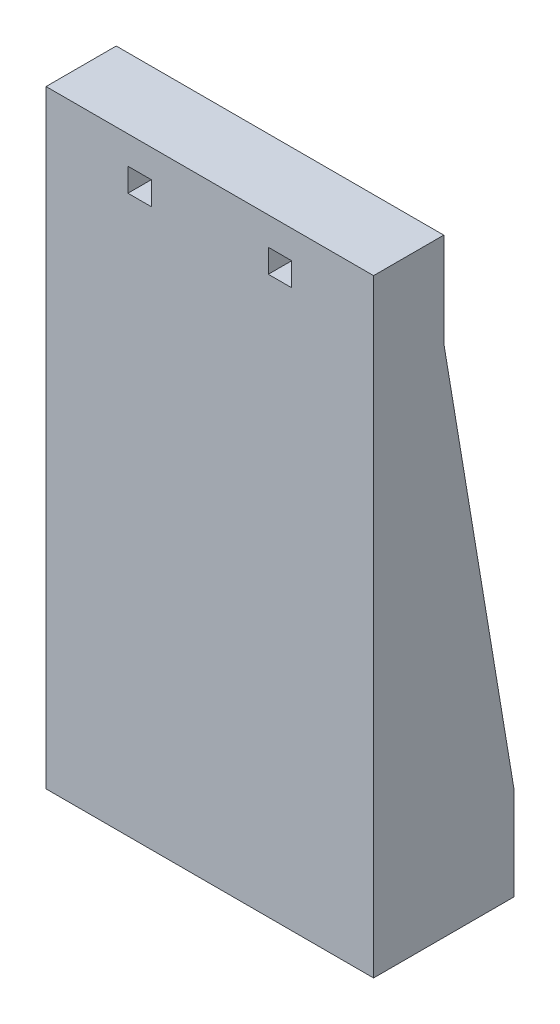
ISO-10303-21;
HEADER;
FILE_DESCRIPTION(('STEP AP214'),'2;1');
FILE_NAME('part.step','',(''),(''),'','','');
FILE_SCHEMA(('AUTOMOTIVE_DESIGN { 1 0 10303 214 1 1 1 1 }'));
ENDSEC;
DATA;
#1=APPLICATION_CONTEXT('core data for automotive mechanical design processes');
#2=APPLICATION_PROTOCOL_DEFINITION('international standard','automotive_design',2000,#1);
#3=PRODUCT_CONTEXT('',#1,'mechanical');
#4=PRODUCT('Part','Part','',(#3));
#5=PRODUCT_RELATED_PRODUCT_CATEGORY('part','',(#4));
#6=PRODUCT_DEFINITION_FORMATION('','',#4);
#7=PRODUCT_DEFINITION_CONTEXT('part definition',#1,'design');
#8=PRODUCT_DEFINITION('design','',#6,#7);
#9=PRODUCT_DEFINITION_SHAPE('','',#8);
#10=(LENGTH_UNIT() NAMED_UNIT(*) SI_UNIT(.MILLI.,.METRE.));
#11=(NAMED_UNIT(*) PLANE_ANGLE_UNIT() SI_UNIT($,.RADIAN.));
#12=(NAMED_UNIT(*) SI_UNIT($,.STERADIAN.) SOLID_ANGLE_UNIT());
#13=UNCERTAINTY_MEASURE_WITH_UNIT(LENGTH_MEASURE(1.E-05),#10,'distance_accuracy_value','');
#14=(GEOMETRIC_REPRESENTATION_CONTEXT(3) GLOBAL_UNCERTAINTY_ASSIGNED_CONTEXT((#13)) GLOBAL_UNIT_ASSIGNED_CONTEXT((#10,
#11,#12)) REPRESENTATION_CONTEXT('',''));
#15=CARTESIAN_POINT('',(0.,0.,0.));
#16=DIRECTION('',(0.,0.,1.));
#17=DIRECTION('',(1.,0.,0.));
#18=AXIS2_PLACEMENT_3D('',#15,#16,#17);
#19=CARTESIAN_POINT('',(35.,0.,15.));
#20=DIRECTION('',(0.,0.,1.));
#21=DIRECTION('',(0.,-1.,0.));
#22=AXIS2_PLACEMENT_3D('',#19,#20,#21);
#23=PLANE('',#22);
#24=DIRECTION('',(-1.,0.,0.));
#25=VECTOR('',#24,1.);
#26=CARTESIAN_POINT('',(17.5,114.,15.));
#27=LINE('',#26,#25);
#28=CARTESIAN_POINT('',(17.5,114.,15.));
#29=VERTEX_POINT('',#28);
#30=CARTESIAN_POINT('',(12.5,114.,15.));
#31=VERTEX_POINT('',#30);
#32=EDGE_CURVE('E56',#29,#31,#27,.T.);
#33=ORIENTED_EDGE('',*,*,#32,.F.);
#34=DIRECTION('',(0.,-1.,0.));
#35=VECTOR('',#34,1.);
#36=CARTESIAN_POINT('',(17.5,114.,15.));
#37=LINE('',#36,#35);
#38=CARTESIAN_POINT('',(17.5,109.,15.));
#39=VERTEX_POINT('',#38);
#40=EDGE_CURVE('E189',#29,#39,#37,.T.);
#41=ORIENTED_EDGE('',*,*,#40,.T.);
#42=DIRECTION('',(-1.,0.,0.));
#43=VECTOR('',#42,1.);
#44=CARTESIAN_POINT('',(17.5,109.,15.));
#45=LINE('',#44,#43);
#46=CARTESIAN_POINT('',(12.5,109.,15.));
#47=VERTEX_POINT('',#46);
#48=EDGE_CURVE('E193',#39,#47,#45,.T.);
#49=ORIENTED_EDGE('',*,*,#48,.T.);
#50=DIRECTION('',(0.,-1.,0.));
#51=VECTOR('',#50,1.);
#52=CARTESIAN_POINT('',(12.5,114.,15.));
#53=LINE('',#52,#51);
#54=EDGE_CURVE('E202',#31,#47,#53,.T.);
#55=ORIENTED_EDGE('',*,*,#54,.F.);
#56=EDGE_LOOP('',(#33,#41,#49,#55));
#57=FACE_BOUND('',#56,.T.);
#58=DIRECTION('',(0.,1.,0.));
#59=VECTOR('',#58,1.);
#60=CARTESIAN_POINT('',(-35.,0.,15.));
#61=LINE('',#60,#59);
#62=CARTESIAN_POINT('',(-35.,-10.,15.));
#63=VERTEX_POINT('',#62);
#64=CARTESIAN_POINT('',(-35.,120.,15.));
#65=VERTEX_POINT('',#64);
#66=EDGE_CURVE('E307',#63,#65,#61,.T.);
#67=ORIENTED_EDGE('',*,*,#66,.F.);
#68=DIRECTION('',(-1.,0.,0.));
#69=VECTOR('',#68,1.);
#70=CARTESIAN_POINT('',(35.,-10.,15.));
#71=LINE('',#70,#69);
#72=CARTESIAN_POINT('',(35.,-10.,15.));
#73=VERTEX_POINT('',#72);
#74=EDGE_CURVE('E49',#73,#63,#71,.T.);
#75=ORIENTED_EDGE('',*,*,#74,.F.);
#76=DIRECTION('',(0.,1.,0.));
#77=VECTOR('',#76,1.);
#78=CARTESIAN_POINT('',(35.,0.,15.));
#79=LINE('',#78,#77);
#80=CARTESIAN_POINT('',(35.,120.,15.));
#81=VERTEX_POINT('',#80);
#82=EDGE_CURVE('E316',#73,#81,#79,.T.);
#83=ORIENTED_EDGE('',*,*,#82,.T.);
#84=DIRECTION('',(-1.,0.,0.));
#85=VECTOR('',#84,1.);
#86=CARTESIAN_POINT('',(35.,120.,15.));
#87=LINE('',#86,#85);
#88=EDGE_CURVE('E331',#81,#65,#87,.T.);
#89=ORIENTED_EDGE('',*,*,#88,.T.);
#90=EDGE_LOOP('',(#67,#75,#83,#89));
#91=FACE_BOUND('',#90,.T.);
#92=DIRECTION('',(-1.,0.,0.));
#93=VECTOR('',#92,1.);
#94=CARTESIAN_POINT('',(-12.5,114.,15.));
#95=LINE('',#94,#93);
#96=CARTESIAN_POINT('',(-12.5,114.,15.));
#97=VERTEX_POINT('',#96);
#98=CARTESIAN_POINT('',(-17.5,114.,15.));
#99=VERTEX_POINT('',#98);
#100=EDGE_CURVE('E230',#97,#99,#95,.T.);
#101=ORIENTED_EDGE('',*,*,#100,.F.);
#102=DIRECTION('',(0.,-1.,0.));
#103=VECTOR('',#102,1.);
#104=CARTESIAN_POINT('',(-12.5,114.,15.));
#105=LINE('',#104,#103);
#106=CARTESIAN_POINT('',(-12.5,109.,15.));
#107=VERTEX_POINT('',#106);
#108=EDGE_CURVE('E64',#97,#107,#105,.T.);
#109=ORIENTED_EDGE('',*,*,#108,.T.);
#110=DIRECTION('',(-1.,0.,0.));
#111=VECTOR('',#110,1.);
#112=CARTESIAN_POINT('',(-12.5,109.,15.));
#113=LINE('',#112,#111);
#114=CARTESIAN_POINT('',(-17.5,109.,15.));
#115=VERTEX_POINT('',#114);
#116=EDGE_CURVE('E239',#107,#115,#113,.T.);
#117=ORIENTED_EDGE('',*,*,#116,.T.);
#118=DIRECTION('',(0.,-1.,0.));
#119=VECTOR('',#118,1.);
#120=CARTESIAN_POINT('',(-17.5,114.,15.));
#121=LINE('',#120,#119);
#122=EDGE_CURVE('E234',#99,#115,#121,.T.);
#123=ORIENTED_EDGE('',*,*,#122,.F.);
#124=EDGE_LOOP('',(#101,#109,#117,#123));
#125=FACE_BOUND('',#124,.T.);
#126=ADVANCED_FACE('F41',(#57,#91,#125),#23,.T.);
#127=CARTESIAN_POINT('',(35.,10.,0.));
#128=DIRECTION('',(0.,1.,0.));
#129=DIRECTION('',(0.,0.,1.));
#130=AXIS2_PLACEMENT_3D('',#127,#128,#129);
#131=PLANE('',#130);
#132=DIRECTION('',(-1.,0.,0.));
#133=VECTOR('',#132,1.);
#134=CARTESIAN_POINT('',(35.,10.,-15.));
#135=LINE('',#134,#133);
#136=CARTESIAN_POINT('',(31.,10.,-15.));
#137=VERTEX_POINT('',#136);
#138=CARTESIAN_POINT('',(-31.,10.,-15.));
#139=VERTEX_POINT('',#138);
#140=EDGE_CURVE('E351',#137,#139,#135,.T.);
#141=ORIENTED_EDGE('',*,*,#140,.T.);
#142=DIRECTION('',(0.,0.,1.));
#143=VECTOR('',#142,1.);
#144=CARTESIAN_POINT('',(-31.,10.,0.));
#145=LINE('',#144,#143);
#146=CARTESIAN_POINT('',(-31.,10.,10.));
#147=VERTEX_POINT('',#146);
#148=EDGE_CURVE('E262',#139,#147,#145,.T.);
#149=ORIENTED_EDGE('',*,*,#148,.T.);
#150=DIRECTION('',(-1.,0.,0.));
#151=VECTOR('',#150,1.);
#152=CARTESIAN_POINT('',(35.,10.,10.));
#153=LINE('',#152,#151);
#154=CARTESIAN_POINT('',(31.,10.,10.));
#155=VERTEX_POINT('',#154);
#156=EDGE_CURVE('E347',#155,#147,#153,.T.);
#157=ORIENTED_EDGE('',*,*,#156,.F.);
#158=DIRECTION('',(0.,0.,-1.));
#159=VECTOR('',#158,1.);
#160=CARTESIAN_POINT('',(31.,10.,0.));
#161=LINE('',#160,#159);
#162=EDGE_CURVE('E290',#155,#137,#161,.T.);
#163=ORIENTED_EDGE('',*,*,#162,.T.);
#164=EDGE_LOOP('',(#141,#149,#157,#163));
#165=FACE_BOUND('',#164,.T.);
#166=ADVANCED_FACE('F388',(#165),#131,.T.);
#167=CARTESIAN_POINT('',(35.,0.,10.));
#168=DIRECTION('',(0.,0.,1.));
#169=DIRECTION('',(0.,-1.,0.));
#170=AXIS2_PLACEMENT_3D('',#167,#168,#169);
#171=PLANE('',#170);
#172=DIRECTION('',(0.,-1.,0.));
#173=VECTOR('',#172,1.);
#174=CARTESIAN_POINT('',(-31.,0.,10.));
#175=LINE('',#174,#173);
#176=CARTESIAN_POINT('',(-31.,100.,10.));
#177=VERTEX_POINT('',#176);
#178=EDGE_CURVE('E268',#177,#147,#175,.T.);
#179=ORIENTED_EDGE('',*,*,#178,.F.);
#180=DIRECTION('',(1.,0.,0.));
#181=VECTOR('',#180,1.);
#182=CARTESIAN_POINT('',(-35.,100.,10.));
#183=LINE('',#182,#181);
#184=CARTESIAN_POINT('',(31.,100.,10.));
#185=VERTEX_POINT('',#184);
#186=EDGE_CURVE('E299',#177,#185,#183,.T.);
#187=ORIENTED_EDGE('',*,*,#186,.T.);
#188=DIRECTION('',(0.,1.,0.));
#189=VECTOR('',#188,1.);
#190=CARTESIAN_POINT('',(31.,0.,10.));
#191=LINE('',#190,#189);
#192=EDGE_CURVE('E283',#155,#185,#191,.T.);
#193=ORIENTED_EDGE('',*,*,#192,.F.);
#194=ORIENTED_EDGE('',*,*,#156,.T.);
#195=EDGE_LOOP('',(#179,#187,#193,#194));
#196=FACE_BOUND('',#195,.T.);
#197=ADVANCED_FACE('F396',(#196),#171,.F.);
#198=CARTESIAN_POINT('',(-35.,100.,10.));
#199=DIRECTION('',(0.,-1.,0.));
#200=DIRECTION('',(0.,0.,-1.));
#201=AXIS2_PLACEMENT_3D('',#198,#199,#200);
#202=PLANE('',#201);
#203=ORIENTED_EDGE('',*,*,#186,.F.);
#204=DIRECTION('',(0.,0.,-1.));
#205=VECTOR('',#204,1.);
#206=CARTESIAN_POINT('',(-31.,100.,10.));
#207=LINE('',#206,#205);
#208=CARTESIAN_POINT('',(-31.,100.,0.));
#209=VERTEX_POINT('',#208);
#210=EDGE_CURVE('E272',#177,#209,#207,.T.);
#211=ORIENTED_EDGE('',*,*,#210,.T.);
#212=DIRECTION('',(1.,0.,0.));
#213=VECTOR('',#212,1.);
#214=CARTESIAN_POINT('',(-35.,100.,0.));
#215=LINE('',#214,#213);
#216=CARTESIAN_POINT('',(31.,100.,0.));
#217=VERTEX_POINT('',#216);
#218=EDGE_CURVE('E312',#209,#217,#215,.T.);
#219=ORIENTED_EDGE('',*,*,#218,.T.);
#220=DIRECTION('',(0.,0.,1.));
#221=VECTOR('',#220,1.);
#222=CARTESIAN_POINT('',(31.,100.,10.));
#223=LINE('',#222,#221);
#224=EDGE_CURVE('E11',#217,#185,#223,.T.);
#225=ORIENTED_EDGE('',*,*,#224,.T.);
#226=EDGE_LOOP('',(#203,#211,#219,#225));
#227=FACE_BOUND('',#226,.T.);
#228=ADVANCED_FACE('F399',(#227),#202,.T.);
#229=CARTESIAN_POINT('',(35.,-10.,0.));
#230=DIRECTION('',(0.,1.,0.));
#231=DIRECTION('',(0.,0.,1.));
#232=AXIS2_PLACEMENT_3D('',#229,#230,#231);
#233=PLANE('',#232);
#234=DIRECTION('',(0.,0.,-1.));
#235=VECTOR('',#234,1.);
#236=CARTESIAN_POINT('',(-35.,-10.,0.));
#237=LINE('',#236,#235);
#238=CARTESIAN_POINT('',(-35.,-10.,-15.));
#239=VERTEX_POINT('',#238);
#240=EDGE_CURVE('E335',#63,#239,#237,.T.);
#241=ORIENTED_EDGE('',*,*,#240,.T.);
#242=DIRECTION('',(-1.,0.,0.));
#243=VECTOR('',#242,1.);
#244=CARTESIAN_POINT('',(35.,-10.,-15.));
#245=LINE('',#244,#243);
#246=CARTESIAN_POINT('',(35.,-10.,-15.));
#247=VERTEX_POINT('',#246);
#248=EDGE_CURVE('E355',#247,#239,#245,.T.);
#249=ORIENTED_EDGE('',*,*,#248,.F.);
#250=DIRECTION('',(0.,0.,-1.));
#251=VECTOR('',#250,1.);
#252=CARTESIAN_POINT('',(35.,-10.,0.));
#253=LINE('',#252,#251);
#254=EDGE_CURVE('E320',#73,#247,#253,.T.);
#255=ORIENTED_EDGE('',*,*,#254,.F.);
#256=ORIENTED_EDGE('',*,*,#74,.T.);
#257=EDGE_LOOP('',(#241,#249,#255,#256));
#258=FACE_BOUND('',#257,.T.);
#259=ADVANCED_FACE('F361',(#258),#233,.F.);
#260=CARTESIAN_POINT('',(35.,0.,-15.));
#261=DIRECTION('',(0.,0.,-1.));
#262=DIRECTION('',(0.,1.,0.));
#263=AXIS2_PLACEMENT_3D('',#260,#261,#262);
#264=PLANE('',#263);
#265=DIRECTION('',(1.,0.,0.));
#266=VECTOR('',#265,1.);
#267=CARTESIAN_POINT('',(35.,9.99999999999999,-15.));
#268=LINE('',#267,#266);
#269=CARTESIAN_POINT('',(-35.,10.,-15.));
#270=VERTEX_POINT('',#269);
#271=EDGE_CURVE('E276',#270,#139,#268,.T.);
#272=ORIENTED_EDGE('',*,*,#271,.T.);
#273=ORIENTED_EDGE('',*,*,#140,.F.);
#274=CARTESIAN_POINT('',(35.,9.99999999999994,-15.));
#275=VERTEX_POINT('',#274);
#276=EDGE_CURVE('E352',#275,#137,#135,.T.);
#277=ORIENTED_EDGE('',*,*,#276,.F.);
#278=DIRECTION('',(0.,-1.,0.));
#279=VECTOR('',#278,1.);
#280=CARTESIAN_POINT('',(35.,0.,-15.));
#281=LINE('',#280,#279);
#282=EDGE_CURVE('E324',#275,#247,#281,.T.);
#283=ORIENTED_EDGE('',*,*,#282,.T.);
#284=ORIENTED_EDGE('',*,*,#248,.T.);
#285=DIRECTION('',(0.,-1.,0.));
#286=VECTOR('',#285,1.);
#287=CARTESIAN_POINT('',(-35.,0.,-15.));
#288=LINE('',#287,#286);
#289=EDGE_CURVE('E339',#270,#239,#288,.T.);
#290=ORIENTED_EDGE('',*,*,#289,.F.);
#291=EDGE_LOOP('',(#272,#273,#277,#283,#284,#290));
#292=FACE_BOUND('',#291,.T.);
#293=ADVANCED_FACE('F384',(#292),#264,.T.);
#294=CARTESIAN_POINT('',(35.,120.,3.33066907387547E-13));
#295=DIRECTION('',(0.,1.,0.));
#296=DIRECTION('',(0.,0.,1.));
#297=AXIS2_PLACEMENT_3D('',#294,#295,#296);
#298=PLANE('',#297);
#299=DIRECTION('',(1.,0.,0.));
#300=VECTOR('',#299,1.);
#301=CARTESIAN_POINT('',(-35.,120.,0.));
#302=LINE('',#301,#300);
#303=CARTESIAN_POINT('',(-35.,120.,0.));
#304=VERTEX_POINT('',#303);
#305=CARTESIAN_POINT('',(35.,120.,0.));
#306=VERTEX_POINT('',#305);
#307=EDGE_CURVE('E303',#304,#306,#302,.T.);
#308=ORIENTED_EDGE('',*,*,#307,.F.);
#309=DIRECTION('',(0.,0.,-1.));
#310=VECTOR('',#309,1.);
#311=CARTESIAN_POINT('',(-35.,120.,3.33066907387547E-13));
#312=LINE('',#311,#310);
#313=EDGE_CURVE('E321',#65,#304,#312,.T.);
#314=ORIENTED_EDGE('',*,*,#313,.F.);
#315=ORIENTED_EDGE('',*,*,#88,.F.);
#316=DIRECTION('',(0.,0.,-1.));
#317=VECTOR('',#316,1.);
#318=CARTESIAN_POINT('',(35.,120.,3.33066907387547E-13));
#319=LINE('',#318,#317);
#320=EDGE_CURVE('E328',#81,#306,#319,.T.);
#321=ORIENTED_EDGE('',*,*,#320,.T.);
#322=EDGE_LOOP('',(#308,#314,#315,#321));
#323=FACE_BOUND('',#322,.T.);
#324=ADVANCED_FACE('F374',(#323),#298,.T.);
#325=CARTESIAN_POINT('',(35.,0.,0.));
#326=DIRECTION('',(1.,0.,0.));
#327=DIRECTION('',(0.,0.,-1.));
#328=AXIS2_PLACEMENT_3D('',#325,#326,#327);
#329=PLANE('',#328);
#330=ORIENTED_EDGE('',*,*,#282,.F.);
#331=DIRECTION('',(0.,-0.986393923832144,-0.164398987305357));
#332=VECTOR('',#331,1.);
#333=CARTESIAN_POINT('',(35.,100.,0.));
#334=LINE('',#333,#332);
#335=CARTESIAN_POINT('',(35.,100.,0.));
#336=VERTEX_POINT('',#335);
#337=EDGE_CURVE('E280',#336,#275,#334,.T.);
#338=ORIENTED_EDGE('',*,*,#337,.F.);
#339=DIRECTION('',(0.,1.,0.));
#340=VECTOR('',#339,1.);
#341=CARTESIAN_POINT('',(35.,120.,0.));
#342=LINE('',#341,#340);
#343=EDGE_CURVE('E294',#336,#306,#342,.T.);
#344=ORIENTED_EDGE('',*,*,#343,.T.);
#345=ORIENTED_EDGE('',*,*,#320,.F.);
#346=ORIENTED_EDGE('',*,*,#82,.F.);
#347=ORIENTED_EDGE('',*,*,#254,.T.);
#348=EDGE_LOOP('',(#330,#338,#344,#345,#346,#347));
#349=FACE_BOUND('',#348,.T.);
#350=ADVANCED_FACE('F414',(#349),#329,.T.);
#351=CARTESIAN_POINT('',(-35.,0.,0.));
#352=DIRECTION('',(1.,0.,0.));
#353=DIRECTION('',(0.,0.,-1.));
#354=AXIS2_PLACEMENT_3D('',#351,#352,#353);
#355=PLANE('',#354);
#356=DIRECTION('',(0.,1.,0.));
#357=VECTOR('',#356,1.);
#358=CARTESIAN_POINT('',(-35.,120.,0.));
#359=LINE('',#358,#357);
#360=CARTESIAN_POINT('',(-35.,100.,0.));
#361=VERTEX_POINT('',#360);
#362=EDGE_CURVE('E295',#361,#304,#359,.T.);
#363=ORIENTED_EDGE('',*,*,#362,.F.);
#364=DIRECTION('',(0.,-0.986393923832144,-0.164398987305357));
#365=VECTOR('',#364,1.);
#366=CARTESIAN_POINT('',(-35.,100.,0.));
#367=LINE('',#366,#365);
#368=EDGE_CURVE('E258',#361,#270,#367,.T.);
#369=ORIENTED_EDGE('',*,*,#368,.T.);
#370=ORIENTED_EDGE('',*,*,#289,.T.);
#371=ORIENTED_EDGE('',*,*,#240,.F.);
#372=ORIENTED_EDGE('',*,*,#66,.T.);
#373=ORIENTED_EDGE('',*,*,#313,.T.);
#374=EDGE_LOOP('',(#363,#369,#370,#371,#372,#373));
#375=FACE_BOUND('',#374,.T.);
#376=ADVANCED_FACE('F368',(#375),#355,.F.);
#377=CARTESIAN_POINT('',(-35.,120.,0.));
#378=DIRECTION('',(0.,0.,-1.));
#379=DIRECTION('',(0.,1.,0.));
#380=AXIS2_PLACEMENT_3D('',#377,#378,#379);
#381=PLANE('',#380);
#382=ORIENTED_EDGE('',*,*,#343,.F.);
#383=EDGE_CURVE('E313',#217,#336,#215,.T.);
#384=ORIENTED_EDGE('',*,*,#383,.F.);
#385=ORIENTED_EDGE('',*,*,#218,.F.);
#386=EDGE_CURVE('E308',#361,#209,#215,.T.);
#387=ORIENTED_EDGE('',*,*,#386,.F.);
#388=ORIENTED_EDGE('',*,*,#362,.T.);
#389=ORIENTED_EDGE('',*,*,#307,.T.);
#390=EDGE_LOOP('',(#382,#384,#385,#387,#388,#389));
#391=FACE_BOUND('',#390,.T.);
#392=ADVANCED_FACE('F409',(#391),#381,.T.);
#393=CARTESIAN_POINT('',(35.,100.,0.));
#394=DIRECTION('',(0.,-0.164398987305357,0.986393923832144));
#395=DIRECTION('',(0.,-0.986393923832144,-0.164398987305357));
#396=AXIS2_PLACEMENT_3D('',#393,#394,#395);
#397=PLANE('',#396);
#398=ORIENTED_EDGE('',*,*,#337,.T.);
#399=ORIENTED_EDGE('',*,*,#276,.T.);
#400=DIRECTION('',(0.,-0.986393923832144,-0.164398987305357));
#401=VECTOR('',#400,1.);
#402=CARTESIAN_POINT('',(31.,100.,0.));
#403=LINE('',#402,#401);
#404=EDGE_CURVE('E279',#217,#137,#403,.T.);
#405=ORIENTED_EDGE('',*,*,#404,.F.);
#406=ORIENTED_EDGE('',*,*,#383,.T.);
#407=EDGE_LOOP('',(#398,#399,#405,#406));
#408=FACE_BOUND('',#407,.T.);
#409=ADVANCED_FACE('F406',(#408),#397,.F.);
#410=CARTESIAN_POINT('',(31.,55.,0.));
#411=DIRECTION('',(1.,0.,0.));
#412=DIRECTION('',(0.,0.,-1.));
#413=AXIS2_PLACEMENT_3D('',#410,#411,#412);
#414=PLANE('',#413);
#415=ORIENTED_EDGE('',*,*,#162,.F.);
#416=ORIENTED_EDGE('',*,*,#192,.T.);
#417=ORIENTED_EDGE('',*,*,#224,.F.);
#418=ORIENTED_EDGE('',*,*,#404,.T.);
#419=EDGE_LOOP('',(#415,#416,#417,#418));
#420=FACE_BOUND('',#419,.T.);
#421=ADVANCED_FACE('F403',(#420),#414,.F.);
#422=CARTESIAN_POINT('',(-35.,100.,0.));
#423=DIRECTION('',(0.,0.164398987305357,-0.986393923832144));
#424=DIRECTION('',(0.,-0.986393923832144,-0.164398987305357));
#425=AXIS2_PLACEMENT_3D('',#422,#423,#424);
#426=PLANE('',#425);
#427=ORIENTED_EDGE('',*,*,#271,.F.);
#428=ORIENTED_EDGE('',*,*,#368,.F.);
#429=ORIENTED_EDGE('',*,*,#386,.T.);
#430=DIRECTION('',(0.,-0.986393923832144,-0.164398987305357));
#431=VECTOR('',#430,1.);
#432=CARTESIAN_POINT('',(-31.,100.,0.));
#433=LINE('',#432,#431);
#434=EDGE_CURVE('E211',#209,#139,#433,.T.);
#435=ORIENTED_EDGE('',*,*,#434,.T.);
#436=EDGE_LOOP('',(#427,#428,#429,#435));
#437=FACE_BOUND('',#436,.T.);
#438=ADVANCED_FACE('F379',(#437),#426,.T.);
#439=CARTESIAN_POINT('',(-31.,55.,0.));
#440=DIRECTION('',(-1.,0.,0.));
#441=DIRECTION('',(0.,0.,1.));
#442=AXIS2_PLACEMENT_3D('',#439,#440,#441);
#443=PLANE('',#442);
#444=ORIENTED_EDGE('',*,*,#210,.F.);
#445=ORIENTED_EDGE('',*,*,#178,.T.);
#446=ORIENTED_EDGE('',*,*,#148,.F.);
#447=ORIENTED_EDGE('',*,*,#434,.F.);
#448=EDGE_LOOP('',(#444,#445,#446,#447));
#449=FACE_BOUND('',#448,.T.);
#450=ADVANCED_FACE('F393',(#449),#443,.F.);
#451=CARTESIAN_POINT('',(-12.5,114.,5.));
#452=DIRECTION('',(-1.,0.,0.));
#453=DIRECTION('',(0.,-1.,0.));
#454=AXIS2_PLACEMENT_3D('',#451,#452,#453);
#455=PLANE('',#454);
#456=ORIENTED_EDGE('',*,*,#108,.F.);
#457=DIRECTION('',(0.,0.,1.));
#458=VECTOR('',#457,1.);
#459=CARTESIAN_POINT('',(-12.5,114.,5.));
#460=LINE('',#459,#458);
#461=CARTESIAN_POINT('',(-12.5,114.,5.));
#462=VERTEX_POINT('',#461);
#463=EDGE_CURVE('E226',#462,#97,#460,.T.);
#464=ORIENTED_EDGE('',*,*,#463,.F.);
#465=DIRECTION('',(0.,-1.,0.));
#466=VECTOR('',#465,1.);
#467=CARTESIAN_POINT('',(-12.5,114.,5.));
#468=LINE('',#467,#466);
#469=CARTESIAN_POINT('',(-12.5,109.,5.));
#470=VERTEX_POINT('',#469);
#471=EDGE_CURVE('E235',#462,#470,#468,.T.);
#472=ORIENTED_EDGE('',*,*,#471,.T.);
#473=DIRECTION('',(0.,0.,1.));
#474=VECTOR('',#473,1.);
#475=CARTESIAN_POINT('',(-12.5,109.,5.));
#476=LINE('',#475,#474);
#477=EDGE_CURVE('E217',#470,#107,#476,.T.);
#478=ORIENTED_EDGE('',*,*,#477,.T.);
#479=EDGE_LOOP('',(#456,#464,#472,#478));
#480=FACE_BOUND('',#479,.T.);
#481=ADVANCED_FACE('F450',(#480),#455,.T.);
#482=CARTESIAN_POINT('',(-12.5,109.,5.));
#483=DIRECTION('',(0.,1.,0.));
#484=DIRECTION('',(0.,0.,1.));
#485=AXIS2_PLACEMENT_3D('',#482,#483,#484);
#486=PLANE('',#485);
#487=ORIENTED_EDGE('',*,*,#116,.F.);
#488=ORIENTED_EDGE('',*,*,#477,.F.);
#489=DIRECTION('',(-1.,0.,0.));
#490=VECTOR('',#489,1.);
#491=CARTESIAN_POINT('',(-12.5,109.,5.));
#492=LINE('',#491,#490);
#493=CARTESIAN_POINT('',(-17.5,109.,5.));
#494=VERTEX_POINT('',#493);
#495=EDGE_CURVE('E252',#470,#494,#492,.T.);
#496=ORIENTED_EDGE('',*,*,#495,.T.);
#497=DIRECTION('',(0.,0.,1.));
#498=VECTOR('',#497,1.);
#499=CARTESIAN_POINT('',(-17.5,109.,5.));
#500=LINE('',#499,#498);
#501=EDGE_CURVE('E220',#494,#115,#500,.T.);
#502=ORIENTED_EDGE('',*,*,#501,.T.);
#503=EDGE_LOOP('',(#487,#488,#496,#502));
#504=FACE_BOUND('',#503,.T.);
#505=ADVANCED_FACE('F453',(#504),#486,.T.);
#506=CARTESIAN_POINT('',(-17.5,114.,5.));
#507=DIRECTION('',(-1.,0.,0.));
#508=DIRECTION('',(0.,-1.,0.));
#509=AXIS2_PLACEMENT_3D('',#506,#507,#508);
#510=PLANE('',#509);
#511=ORIENTED_EDGE('',*,*,#122,.T.);
#512=ORIENTED_EDGE('',*,*,#501,.F.);
#513=DIRECTION('',(0.,-1.,0.));
#514=VECTOR('',#513,1.);
#515=CARTESIAN_POINT('',(-17.5,114.,5.));
#516=LINE('',#515,#514);
#517=CARTESIAN_POINT('',(-17.5,114.,5.));
#518=VERTEX_POINT('',#517);
#519=EDGE_CURVE('E248',#518,#494,#516,.T.);
#520=ORIENTED_EDGE('',*,*,#519,.F.);
#521=DIRECTION('',(0.,0.,1.));
#522=VECTOR('',#521,1.);
#523=CARTESIAN_POINT('',(-17.5,114.,5.));
#524=LINE('',#523,#522);
#525=EDGE_CURVE('E223',#518,#99,#524,.T.);
#526=ORIENTED_EDGE('',*,*,#525,.T.);
#527=EDGE_LOOP('',(#511,#512,#520,#526));
#528=FACE_BOUND('',#527,.T.);
#529=ADVANCED_FACE('F456',(#528),#510,.F.);
#530=CARTESIAN_POINT('',(-12.5,114.,5.));
#531=DIRECTION('',(0.,1.,0.));
#532=DIRECTION('',(0.,0.,1.));
#533=AXIS2_PLACEMENT_3D('',#530,#531,#532);
#534=PLANE('',#533);
#535=ORIENTED_EDGE('',*,*,#100,.T.);
#536=ORIENTED_EDGE('',*,*,#525,.F.);
#537=DIRECTION('',(-1.,0.,0.));
#538=VECTOR('',#537,1.);
#539=CARTESIAN_POINT('',(-12.5,114.,5.));
#540=LINE('',#539,#538);
#541=EDGE_CURVE('E229',#462,#518,#540,.T.);
#542=ORIENTED_EDGE('',*,*,#541,.F.);
#543=ORIENTED_EDGE('',*,*,#463,.T.);
#544=EDGE_LOOP('',(#535,#536,#542,#543));
#545=FACE_BOUND('',#544,.T.);
#546=ADVANCED_FACE('F460',(#545),#534,.F.);
#547=CARTESIAN_POINT('',(0.,0.,5.));
#548=DIRECTION('',(0.,0.,-1.));
#549=DIRECTION('',(-1.,0.,0.));
#550=AXIS2_PLACEMENT_3D('',#547,#548,#549);
#551=PLANE('',#550);
#552=ORIENTED_EDGE('',*,*,#471,.F.);
#553=ORIENTED_EDGE('',*,*,#541,.T.);
#554=ORIENTED_EDGE('',*,*,#519,.T.);
#555=ORIENTED_EDGE('',*,*,#495,.F.);
#556=EDGE_LOOP('',(#552,#553,#554,#555));
#557=FACE_BOUND('',#556,.T.);
#558=ADVANCED_FACE('F444',(#557),#551,.F.);
#559=CARTESIAN_POINT('',(17.5,114.,5.));
#560=DIRECTION('',(0.,1.,0.));
#561=DIRECTION('',(0.,0.,1.));
#562=AXIS2_PLACEMENT_3D('',#559,#560,#561);
#563=PLANE('',#562);
#564=ORIENTED_EDGE('',*,*,#32,.T.);
#565=DIRECTION('',(0.,0.,1.));
#566=VECTOR('',#565,1.);
#567=CARTESIAN_POINT('',(12.5,114.,5.));
#568=LINE('',#567,#566);
#569=CARTESIAN_POINT('',(12.5,114.,5.));
#570=VERTEX_POINT('',#569);
#571=EDGE_CURVE('E165',#570,#31,#568,.T.);
#572=ORIENTED_EDGE('',*,*,#571,.F.);
#573=DIRECTION('',(-1.,0.,0.));
#574=VECTOR('',#573,1.);
#575=CARTESIAN_POINT('',(17.5,114.,5.));
#576=LINE('',#575,#574);
#577=CARTESIAN_POINT('',(17.5,114.,5.));
#578=VERTEX_POINT('',#577);
#579=EDGE_CURVE('E169',#578,#570,#576,.T.);
#580=ORIENTED_EDGE('',*,*,#579,.F.);
#581=DIRECTION('',(0.,0.,1.));
#582=VECTOR('',#581,1.);
#583=CARTESIAN_POINT('',(17.5,114.,5.));
#584=LINE('',#583,#582);
#585=EDGE_CURVE('E208',#578,#29,#584,.T.);
#586=ORIENTED_EDGE('',*,*,#585,.T.);
#587=EDGE_LOOP('',(#564,#572,#580,#586));
#588=FACE_BOUND('',#587,.T.);
#589=ADVANCED_FACE('F167',(#588),#563,.F.);
#590=CARTESIAN_POINT('',(17.5,114.,5.));
#591=DIRECTION('',(-1.,0.,0.));
#592=DIRECTION('',(0.,-1.,0.));
#593=AXIS2_PLACEMENT_3D('',#590,#591,#592);
#594=PLANE('',#593);
#595=ORIENTED_EDGE('',*,*,#40,.F.);
#596=ORIENTED_EDGE('',*,*,#585,.F.);
#597=DIRECTION('',(0.,-1.,0.));
#598=VECTOR('',#597,1.);
#599=CARTESIAN_POINT('',(17.5,114.,5.));
#600=LINE('',#599,#598);
#601=CARTESIAN_POINT('',(17.5,109.,5.));
#602=VERTEX_POINT('',#601);
#603=EDGE_CURVE('E175',#578,#602,#600,.T.);
#604=ORIENTED_EDGE('',*,*,#603,.T.);
#605=DIRECTION('',(0.,0.,1.));
#606=VECTOR('',#605,1.);
#607=CARTESIAN_POINT('',(17.5,109.,5.));
#608=LINE('',#607,#606);
#609=EDGE_CURVE('E212',#602,#39,#608,.T.);
#610=ORIENTED_EDGE('',*,*,#609,.T.);
#611=EDGE_LOOP('',(#595,#596,#604,#610));
#612=FACE_BOUND('',#611,.T.);
#613=ADVANCED_FACE('F436',(#612),#594,.T.);
#614=CARTESIAN_POINT('',(17.5,109.,5.));
#615=DIRECTION('',(0.,1.,0.));
#616=DIRECTION('',(0.,0.,1.));
#617=AXIS2_PLACEMENT_3D('',#614,#615,#616);
#618=PLANE('',#617);
#619=ORIENTED_EDGE('',*,*,#48,.F.);
#620=ORIENTED_EDGE('',*,*,#609,.F.);
#621=DIRECTION('',(-1.,0.,0.));
#622=VECTOR('',#621,1.);
#623=CARTESIAN_POINT('',(17.5,109.,5.));
#624=LINE('',#623,#622);
#625=CARTESIAN_POINT('',(12.5,109.,5.));
#626=VERTEX_POINT('',#625);
#627=EDGE_CURVE('E184',#602,#626,#624,.T.);
#628=ORIENTED_EDGE('',*,*,#627,.T.);
#629=DIRECTION('',(0.,0.,1.));
#630=VECTOR('',#629,1.);
#631=CARTESIAN_POINT('',(12.5,109.,5.));
#632=LINE('',#631,#630);
#633=EDGE_CURVE('E174',#626,#47,#632,.T.);
#634=ORIENTED_EDGE('',*,*,#633,.T.);
#635=EDGE_LOOP('',(#619,#620,#628,#634));
#636=FACE_BOUND('',#635,.T.);
#637=ADVANCED_FACE('F434',(#636),#618,.T.);
#638=CARTESIAN_POINT('',(12.5,114.,5.));
#639=DIRECTION('',(-1.,0.,0.));
#640=DIRECTION('',(0.,0.,1.));
#641=AXIS2_PLACEMENT_3D('',#638,#639,#640);
#642=PLANE('',#641);
#643=ORIENTED_EDGE('',*,*,#54,.T.);
#644=ORIENTED_EDGE('',*,*,#633,.F.);
#645=DIRECTION('',(0.,-1.,0.));
#646=VECTOR('',#645,1.);
#647=CARTESIAN_POINT('',(12.5,114.,5.));
#648=LINE('',#647,#646);
#649=EDGE_CURVE('E179',#570,#626,#648,.T.);
#650=ORIENTED_EDGE('',*,*,#649,.F.);
#651=ORIENTED_EDGE('',*,*,#571,.T.);
#652=EDGE_LOOP('',(#643,#644,#650,#651));
#653=FACE_BOUND('',#652,.T.);
#654=ADVANCED_FACE('F180',(#653),#642,.F.);
#655=CARTESIAN_POINT('',(0.,0.,5.));
#656=DIRECTION('',(0.,0.,1.));
#657=DIRECTION('',(1.,0.,0.));
#658=AXIS2_PLACEMENT_3D('',#655,#656,#657);
#659=PLANE('',#658);
#660=ORIENTED_EDGE('',*,*,#579,.T.);
#661=ORIENTED_EDGE('',*,*,#649,.T.);
#662=ORIENTED_EDGE('',*,*,#627,.F.);
#663=ORIENTED_EDGE('',*,*,#603,.F.);
#664=EDGE_LOOP('',(#660,#661,#662,#663));
#665=FACE_BOUND('',#664,.T.);
#666=ADVANCED_FACE('F187',(#665),#659,.T.);
#667=CLOSED_SHELL('',(#126,#166,#197,#228,#259,#293,#324,#350,#376,#392,#409,#421,#438,#450,
#481,#505,#529,#546,#558,#589,#613,#637,#654,#666));
#668=MANIFOLD_SOLID_BREP('B2',#667);
#669=ADVANCED_BREP_SHAPE_REPRESENTATION('',(#18,#668),#14);
#670=SHAPE_DEFINITION_REPRESENTATION(#9,#669);
ENDSEC;
END-ISO-10303-21;
